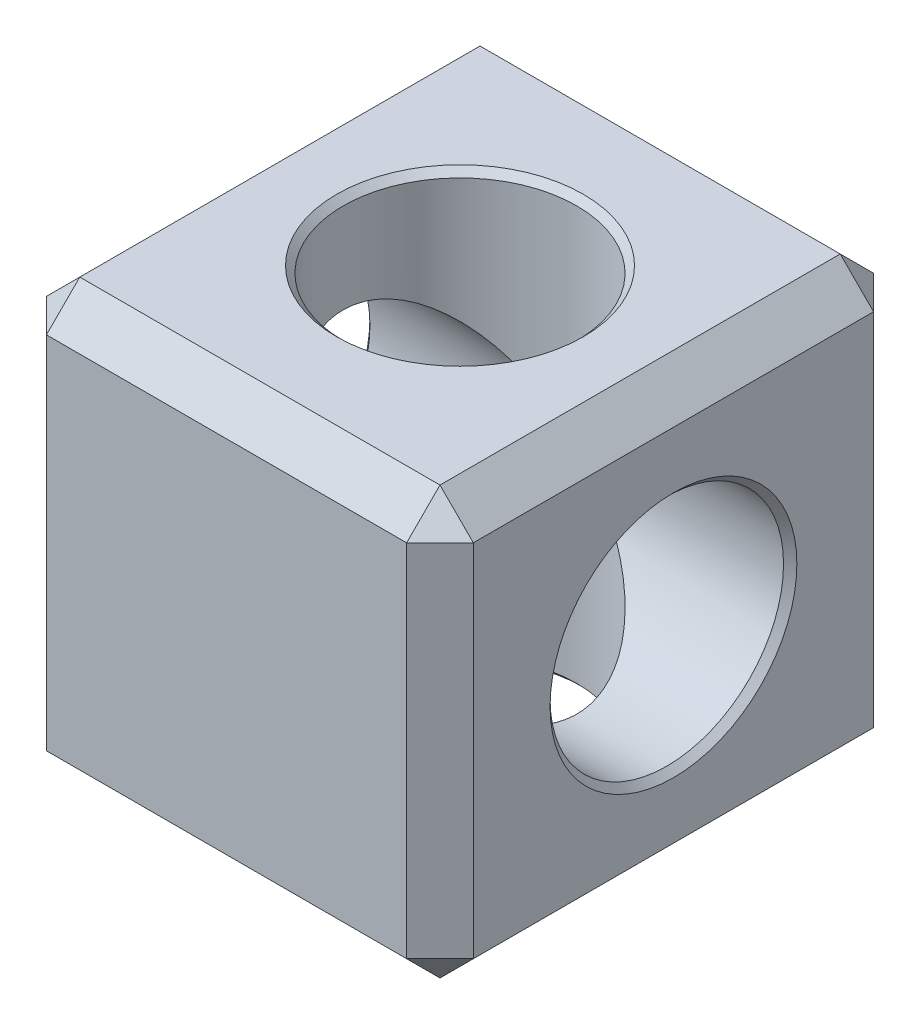
ISO-10303-21;
HEADER;
FILE_DESCRIPTION(('STEP AP214'),'2;1');
FILE_NAME('part.step','',(''),(''),'','','');
FILE_SCHEMA(('AUTOMOTIVE_DESIGN { 1 0 10303 214 1 1 1 1 }'));
ENDSEC;
DATA;
#1=APPLICATION_CONTEXT('core data for automotive mechanical design processes');
#2=APPLICATION_PROTOCOL_DEFINITION('international standard','automotive_design',2000,#1);
#3=PRODUCT_CONTEXT('',#1,'mechanical');
#4=PRODUCT('Part','Part','',(#3));
#5=PRODUCT_RELATED_PRODUCT_CATEGORY('part','',(#4));
#6=PRODUCT_DEFINITION_FORMATION('','',#4);
#7=PRODUCT_DEFINITION_CONTEXT('part definition',#1,'design');
#8=PRODUCT_DEFINITION('design','',#6,#7);
#9=PRODUCT_DEFINITION_SHAPE('','',#8);
#10=(LENGTH_UNIT() NAMED_UNIT(*) SI_UNIT(.MILLI.,.METRE.));
#11=(NAMED_UNIT(*) PLANE_ANGLE_UNIT() SI_UNIT($,.RADIAN.));
#12=(NAMED_UNIT(*) SI_UNIT($,.STERADIAN.) SOLID_ANGLE_UNIT());
#13=UNCERTAINTY_MEASURE_WITH_UNIT(LENGTH_MEASURE(1.E-05),#10,'distance_accuracy_value','');
#14=(GEOMETRIC_REPRESENTATION_CONTEXT(3) GLOBAL_UNCERTAINTY_ASSIGNED_CONTEXT((#13)) GLOBAL_UNIT_ASSIGNED_CONTEXT((#10,
#11,#12)) REPRESENTATION_CONTEXT('',''));
#15=CARTESIAN_POINT('',(0.,0.,0.));
#16=DIRECTION('',(0.,0.,1.));
#17=DIRECTION('',(1.,0.,0.));
#18=AXIS2_PLACEMENT_3D('',#15,#16,#17);
#19=CARTESIAN_POINT('',(0.,-32.,0.));
#20=DIRECTION('',(0.,1.,0.));
#21=DIRECTION('',(0.,0.,1.));
#22=AXIS2_PLACEMENT_3D('',#19,#20,#21);
#23=CYLINDRICAL_SURFACE('',#22,17.5);
#24=CARTESIAN_POINT('',(0.,31.,0.));
#25=DIRECTION('',(0.,-1.,0.));
#26=DIRECTION('',(0.,0.,-1.));
#27=AXIS2_PLACEMENT_3D('',#24,#25,#26);
#28=CIRCLE('',#27,17.5);
#29=CARTESIAN_POINT('',(0.,31.,-17.5));
#30=VERTEX_POINT('',#29);
#31=EDGE_CURVE('E282',#30,#30,#28,.F.);
#32=ORIENTED_EDGE('',*,*,#31,.T.);
#33=EDGE_LOOP('',(#32));
#34=FACE_BOUND('',#33,.T.);
#35=CARTESIAN_POINT('',(0.,0.,0.));
#36=DIRECTION('',(0.707106781186544,-0.707106781186551,0.));
#37=DIRECTION('',(-0.707106781186551,-0.707106781186544,0.));
#38=AXIS2_PLACEMENT_3D('',#35,#36,#37);
#39=ELLIPSE('',#38,24.748737341529,17.5);
#40=CARTESIAN_POINT('',(0.,0.,-17.5));
#41=VERTEX_POINT('',#40);
#42=CARTESIAN_POINT('',(0.,0.,17.5));
#43=VERTEX_POINT('',#42);
#44=EDGE_CURVE('E135',#41,#43,#39,.T.);
#45=ORIENTED_EDGE('',*,*,#44,.T.);
#46=CARTESIAN_POINT('',(0.,0.,0.));
#47=DIRECTION('',(-0.707106781186551,-0.707106781186544,0.));
#48=DIRECTION('',(0.707106781186544,-0.707106781186551,0.));
#49=AXIS2_PLACEMENT_3D('',#46,#47,#48);
#50=ELLIPSE('',#49,24.7487373415293,17.5);
#51=EDGE_CURVE('E133',#43,#41,#50,.T.);
#52=ORIENTED_EDGE('',*,*,#51,.T.);
#53=EDGE_LOOP('',(#45,#52));
#54=FACE_BOUND('',#53,.T.);
#55=ADVANCED_FACE('F38',(#34,#54),#23,.F.);
#56=CARTESIAN_POINT('',(32.,32.,35.));
#57=DIRECTION('',(-1.,0.,0.));
#58=DIRECTION('',(0.,0.,1.));
#59=AXIS2_PLACEMENT_3D('',#56,#57,#58);
#60=PLANE('',#59);
#61=CARTESIAN_POINT('',(32.,-1.1172740284298E-13,0.));
#62=DIRECTION('',(-1.,0.,0.));
#63=DIRECTION('',(0.,0.,1.));
#64=AXIS2_PLACEMENT_3D('',#61,#62,#63);
#65=CIRCLE('',#64,18.4999999999999);
#66=CARTESIAN_POINT('',(32.,-1.1172740284298E-13,18.4999999999999));
#67=VERTEX_POINT('',#66);
#68=EDGE_CURVE('E279',#67,#67,#65,.T.);
#69=ORIENTED_EDGE('',*,*,#68,.T.);
#70=EDGE_LOOP('',(#69));
#71=FACE_BOUND('',#70,.T.);
#72=DIRECTION('',(0.,0.,1.));
#73=VECTOR('',#72,1.);
#74=CARTESIAN_POINT('',(32.,27.,35.));
#75=LINE('',#74,#73);
#76=CARTESIAN_POINT('',(32.,27.,-30.));
#77=VERTEX_POINT('',#76);
#78=CARTESIAN_POINT('',(32.,27.,30.));
#79=VERTEX_POINT('',#78);
#80=EDGE_CURVE('E172',#77,#79,#75,.T.);
#81=ORIENTED_EDGE('',*,*,#80,.T.);
#82=DIRECTION('',(0.,-1.,0.));
#83=VECTOR('',#82,1.);
#84=CARTESIAN_POINT('',(32.,32.,30.));
#85=LINE('',#84,#83);
#86=CARTESIAN_POINT('',(32.,-27.,30.));
#87=VERTEX_POINT('',#86);
#88=EDGE_CURVE('E178',#79,#87,#85,.T.);
#89=ORIENTED_EDGE('',*,*,#88,.T.);
#90=DIRECTION('',(0.,0.,-1.));
#91=VECTOR('',#90,1.);
#92=CARTESIAN_POINT('',(32.,-27.,-35.));
#93=LINE('',#92,#91);
#94=CARTESIAN_POINT('',(32.,-27.,-30.));
#95=VERTEX_POINT('',#94);
#96=EDGE_CURVE('E176',#87,#95,#93,.T.);
#97=ORIENTED_EDGE('',*,*,#96,.T.);
#98=DIRECTION('',(0.,1.,0.));
#99=VECTOR('',#98,1.);
#100=CARTESIAN_POINT('',(32.,32.,-30.));
#101=LINE('',#100,#99);
#102=EDGE_CURVE('E174',#95,#77,#101,.T.);
#103=ORIENTED_EDGE('',*,*,#102,.T.);
#104=EDGE_LOOP('',(#81,#89,#97,#103));
#105=FACE_BOUND('',#104,.T.);
#106=ADVANCED_FACE('F303',(#71,#105),#60,.F.);
#107=CARTESIAN_POINT('',(-32.,32.,-35.));
#108=DIRECTION('',(0.,0.,1.));
#109=DIRECTION('',(1.,0.,0.));
#110=AXIS2_PLACEMENT_3D('',#107,#108,#109);
#111=PLANE('',#110);
#112=DIRECTION('',(-1.,0.,0.));
#113=VECTOR('',#112,1.);
#114=CARTESIAN_POINT('',(-32.,-27.,-35.));
#115=LINE('',#114,#113);
#116=CARTESIAN_POINT('',(27.,-27.,-35.));
#117=VERTEX_POINT('',#116);
#118=CARTESIAN_POINT('',(-27.,-27.,-35.));
#119=VERTEX_POINT('',#118);
#120=EDGE_CURVE('E194',#117,#119,#115,.T.);
#121=ORIENTED_EDGE('',*,*,#120,.T.);
#122=DIRECTION('',(0.,1.,0.));
#123=VECTOR('',#122,1.);
#124=CARTESIAN_POINT('',(-27.,32.,-35.));
#125=LINE('',#124,#123);
#126=CARTESIAN_POINT('',(-27.,27.,-35.));
#127=VERTEX_POINT('',#126);
#128=EDGE_CURVE('E196',#119,#127,#125,.T.);
#129=ORIENTED_EDGE('',*,*,#128,.T.);
#130=DIRECTION('',(1.,0.,0.));
#131=VECTOR('',#130,1.);
#132=CARTESIAN_POINT('',(-32.,27.,-35.));
#133=LINE('',#132,#131);
#134=CARTESIAN_POINT('',(27.,27.,-35.));
#135=VERTEX_POINT('',#134);
#136=EDGE_CURVE('E190',#127,#135,#133,.T.);
#137=ORIENTED_EDGE('',*,*,#136,.T.);
#138=DIRECTION('',(0.,-1.,0.));
#139=VECTOR('',#138,1.);
#140=CARTESIAN_POINT('',(27.,32.,-35.));
#141=LINE('',#140,#139);
#142=EDGE_CURVE('E192',#135,#117,#141,.T.);
#143=ORIENTED_EDGE('',*,*,#142,.T.);
#144=EDGE_LOOP('',(#121,#129,#137,#143));
#145=FACE_BOUND('',#144,.T.);
#146=ADVANCED_FACE('F309',(#145),#111,.F.);
#147=CARTESIAN_POINT('',(-32.,32.,35.));
#148=DIRECTION('',(1.,0.,0.));
#149=DIRECTION('',(0.,0.,-1.));
#150=AXIS2_PLACEMENT_3D('',#147,#148,#149);
#151=PLANE('',#150);
#152=CARTESIAN_POINT('',(-32.,1.1172740284298E-13,0.));
#153=DIRECTION('',(1.,0.,0.));
#154=DIRECTION('',(0.,0.,-1.));
#155=AXIS2_PLACEMENT_3D('',#152,#153,#154);
#156=CIRCLE('',#155,18.4999999999998);
#157=CARTESIAN_POINT('',(-32.,1.1172740284298E-13,-18.4999999999998));
#158=VERTEX_POINT('',#157);
#159=EDGE_CURVE('E47',#158,#158,#156,.T.);
#160=ORIENTED_EDGE('',*,*,#159,.T.);
#161=EDGE_LOOP('',(#160));
#162=FACE_BOUND('',#161,.T.);
#163=DIRECTION('',(0.,0.,1.));
#164=VECTOR('',#163,1.);
#165=CARTESIAN_POINT('',(-32.,-27.,35.));
#166=LINE('',#165,#164);
#167=CARTESIAN_POINT('',(-32.,-27.,-30.));
#168=VERTEX_POINT('',#167);
#169=CARTESIAN_POINT('',(-32.,-27.,30.));
#170=VERTEX_POINT('',#169);
#171=EDGE_CURVE('E185',#168,#170,#166,.T.);
#172=ORIENTED_EDGE('',*,*,#171,.T.);
#173=DIRECTION('',(0.,1.,0.));
#174=VECTOR('',#173,1.);
#175=CARTESIAN_POINT('',(-32.,32.,30.));
#176=LINE('',#175,#174);
#177=CARTESIAN_POINT('',(-32.,27.,30.));
#178=VERTEX_POINT('',#177);
#179=EDGE_CURVE('E187',#170,#178,#176,.T.);
#180=ORIENTED_EDGE('',*,*,#179,.T.);
#181=DIRECTION('',(0.,0.,-1.));
#182=VECTOR('',#181,1.);
#183=CARTESIAN_POINT('',(-32.,27.,35.));
#184=LINE('',#183,#182);
#185=CARTESIAN_POINT('',(-32.,27.,-30.));
#186=VERTEX_POINT('',#185);
#187=EDGE_CURVE('E181',#178,#186,#184,.T.);
#188=ORIENTED_EDGE('',*,*,#187,.T.);
#189=DIRECTION('',(0.,-1.,0.));
#190=VECTOR('',#189,1.);
#191=CARTESIAN_POINT('',(-32.,32.,-30.));
#192=LINE('',#191,#190);
#193=EDGE_CURVE('E183',#186,#168,#192,.T.);
#194=ORIENTED_EDGE('',*,*,#193,.T.);
#195=EDGE_LOOP('',(#172,#180,#188,#194));
#196=FACE_BOUND('',#195,.T.);
#197=ADVANCED_FACE('F290',(#162,#196),#151,.F.);
#198=CARTESIAN_POINT('',(-32.,32.,35.));
#199=DIRECTION('',(0.,0.,-1.));
#200=DIRECTION('',(-1.,0.,0.));
#201=AXIS2_PLACEMENT_3D('',#198,#199,#200);
#202=PLANE('',#201);
#203=DIRECTION('',(0.,-1.,0.));
#204=VECTOR('',#203,1.);
#205=CARTESIAN_POINT('',(-27.,32.,35.));
#206=LINE('',#205,#204);
#207=CARTESIAN_POINT('',(-27.,27.,35.));
#208=VERTEX_POINT('',#207);
#209=CARTESIAN_POINT('',(-27.,-27.,35.));
#210=VERTEX_POINT('',#209);
#211=EDGE_CURVE('E154',#208,#210,#206,.T.);
#212=ORIENTED_EDGE('',*,*,#211,.T.);
#213=DIRECTION('',(1.,0.,0.));
#214=VECTOR('',#213,1.);
#215=CARTESIAN_POINT('',(32.,-27.,35.));
#216=LINE('',#215,#214);
#217=CARTESIAN_POINT('',(27.,-27.,35.));
#218=VERTEX_POINT('',#217);
#219=EDGE_CURVE('E160',#210,#218,#216,.T.);
#220=ORIENTED_EDGE('',*,*,#219,.T.);
#221=DIRECTION('',(0.,1.,0.));
#222=VECTOR('',#221,1.);
#223=CARTESIAN_POINT('',(27.,32.,35.));
#224=LINE('',#223,#222);
#225=CARTESIAN_POINT('',(27.,27.,35.));
#226=VERTEX_POINT('',#225);
#227=EDGE_CURVE('E158',#218,#226,#224,.T.);
#228=ORIENTED_EDGE('',*,*,#227,.T.);
#229=DIRECTION('',(-1.,0.,0.));
#230=VECTOR('',#229,1.);
#231=CARTESIAN_POINT('',(-32.,27.,35.));
#232=LINE('',#231,#230);
#233=EDGE_CURVE('E152',#226,#208,#232,.T.);
#234=ORIENTED_EDGE('',*,*,#233,.T.);
#235=EDGE_LOOP('',(#212,#220,#228,#234));
#236=FACE_BOUND('',#235,.T.);
#237=ADVANCED_FACE('F356',(#236),#202,.F.);
#238=CARTESIAN_POINT('',(0.,32.,0.));
#239=DIRECTION('',(0.,-1.,0.));
#240=DIRECTION('',(0.,0.,-1.));
#241=AXIS2_PLACEMENT_3D('',#238,#239,#240);
#242=PLANE('',#241);
#243=CARTESIAN_POINT('',(0.,32.,0.));
#244=DIRECTION('',(0.,-1.,0.));
#245=DIRECTION('',(0.,0.,-1.));
#246=AXIS2_PLACEMENT_3D('',#243,#244,#245);
#247=CIRCLE('',#246,18.5);
#248=CARTESIAN_POINT('',(0.,32.,-18.5));
#249=VERTEX_POINT('',#248);
#250=EDGE_CURVE('E285',#249,#249,#247,.T.);
#251=ORIENTED_EDGE('',*,*,#250,.T.);
#252=EDGE_LOOP('',(#251));
#253=FACE_BOUND('',#252,.T.);
#254=DIRECTION('',(0.,0.,1.));
#255=VECTOR('',#254,1.);
#256=CARTESIAN_POINT('',(-27.,32.,0.));
#257=LINE('',#256,#255);
#258=CARTESIAN_POINT('',(-27.,32.,-30.));
#259=VERTEX_POINT('',#258);
#260=CARTESIAN_POINT('',(-27.,32.,30.));
#261=VERTEX_POINT('',#260);
#262=EDGE_CURVE('E54',#259,#261,#257,.T.);
#263=ORIENTED_EDGE('',*,*,#262,.T.);
#264=DIRECTION('',(1.,0.,0.));
#265=VECTOR('',#264,1.);
#266=CARTESIAN_POINT('',(0.,32.,30.));
#267=LINE('',#266,#265);
#268=CARTESIAN_POINT('',(27.,32.,30.));
#269=VERTEX_POINT('',#268);
#270=EDGE_CURVE('E203',#261,#269,#267,.T.);
#271=ORIENTED_EDGE('',*,*,#270,.T.);
#272=DIRECTION('',(0.,0.,-1.));
#273=VECTOR('',#272,1.);
#274=CARTESIAN_POINT('',(27.,32.,0.));
#275=LINE('',#274,#273);
#276=CARTESIAN_POINT('',(27.,32.,-30.));
#277=VERTEX_POINT('',#276);
#278=EDGE_CURVE('E199',#269,#277,#275,.T.);
#279=ORIENTED_EDGE('',*,*,#278,.T.);
#280=DIRECTION('',(-1.,0.,0.));
#281=VECTOR('',#280,1.);
#282=CARTESIAN_POINT('',(0.,32.,-30.));
#283=LINE('',#282,#281);
#284=EDGE_CURVE('E59',#277,#259,#283,.T.);
#285=ORIENTED_EDGE('',*,*,#284,.T.);
#286=EDGE_LOOP('',(#263,#271,#279,#285));
#287=FACE_BOUND('',#286,.T.);
#288=ADVANCED_FACE('F322',(#253,#287),#242,.F.);
#289=CARTESIAN_POINT('',(0.,-32.,0.));
#290=DIRECTION('',(0.,-1.,0.));
#291=DIRECTION('',(0.,0.,-1.));
#292=AXIS2_PLACEMENT_3D('',#289,#290,#291);
#293=PLANE('',#292);
#294=CARTESIAN_POINT('',(0.,-32.,0.));
#295=DIRECTION('',(0.,-1.,0.));
#296=DIRECTION('',(0.,0.,-1.));
#297=AXIS2_PLACEMENT_3D('',#294,#295,#296);
#298=CIRCLE('',#297,18.5);
#299=CARTESIAN_POINT('',(0.,-32.,-18.5));
#300=VERTEX_POINT('',#299);
#301=EDGE_CURVE('E205',#300,#300,#298,.F.);
#302=ORIENTED_EDGE('',*,*,#301,.T.);
#303=EDGE_LOOP('',(#302));
#304=FACE_BOUND('',#303,.T.);
#305=DIRECTION('',(0.,0.,1.));
#306=VECTOR('',#305,1.);
#307=CARTESIAN_POINT('',(27.,-32.,35.));
#308=LINE('',#307,#306);
#309=CARTESIAN_POINT('',(27.,-32.,-30.));
#310=VERTEX_POINT('',#309);
#311=CARTESIAN_POINT('',(27.,-32.,30.));
#312=VERTEX_POINT('',#311);
#313=EDGE_CURVE('E163',#310,#312,#308,.T.);
#314=ORIENTED_EDGE('',*,*,#313,.T.);
#315=DIRECTION('',(-1.,0.,0.));
#316=VECTOR('',#315,1.);
#317=CARTESIAN_POINT('',(-32.,-32.,30.));
#318=LINE('',#317,#316);
#319=CARTESIAN_POINT('',(-27.,-32.,30.));
#320=VERTEX_POINT('',#319);
#321=EDGE_CURVE('E169',#312,#320,#318,.T.);
#322=ORIENTED_EDGE('',*,*,#321,.T.);
#323=DIRECTION('',(0.,0.,-1.));
#324=VECTOR('',#323,1.);
#325=CARTESIAN_POINT('',(-27.,-32.,-35.));
#326=LINE('',#325,#324);
#327=CARTESIAN_POINT('',(-27.,-32.,-30.));
#328=VERTEX_POINT('',#327);
#329=EDGE_CURVE('E167',#320,#328,#326,.T.);
#330=ORIENTED_EDGE('',*,*,#329,.T.);
#331=DIRECTION('',(1.,0.,0.));
#332=VECTOR('',#331,1.);
#333=CARTESIAN_POINT('',(32.,-32.,-30.));
#334=LINE('',#333,#332);
#335=EDGE_CURVE('E165',#328,#310,#334,.T.);
#336=ORIENTED_EDGE('',*,*,#335,.T.);
#337=EDGE_LOOP('',(#314,#322,#330,#336));
#338=FACE_BOUND('',#337,.T.);
#339=ADVANCED_FACE('F315',(#304,#338),#293,.T.);
#340=CARTESIAN_POINT('',(0.,-31.,0.));
#341=DIRECTION('',(0.,-1.,0.));
#342=DIRECTION('',(0.,0.,-1.));
#343=AXIS2_PLACEMENT_3D('',#340,#341,#342);
#344=CIRCLE('',#343,17.5);
#345=CARTESIAN_POINT('',(0.,-31.,-17.5));
#346=VERTEX_POINT('',#345);
#347=EDGE_CURVE('E273',#346,#346,#344,.T.);
#348=ORIENTED_EDGE('',*,*,#347,.T.);
#349=EDGE_LOOP('',(#348));
#350=FACE_BOUND('',#349,.T.);
#351=CARTESIAN_POINT('',(0.,0.,0.));
#352=DIRECTION('',(-0.707106781186551,-0.707106781186544,0.));
#353=DIRECTION('',(0.707106781186544,-0.707106781186551,0.));
#354=AXIS2_PLACEMENT_3D('',#351,#352,#353);
#355=ELLIPSE('',#354,24.7487373415293,17.5);
#356=EDGE_CURVE('E140',#43,#41,#355,.F.);
#357=ORIENTED_EDGE('',*,*,#356,.T.);
#358=CARTESIAN_POINT('',(0.,0.,0.));
#359=DIRECTION('',(0.707106781186544,-0.707106781186551,0.));
#360=DIRECTION('',(-0.707106781186551,-0.707106781186544,0.));
#361=AXIS2_PLACEMENT_3D('',#358,#359,#360);
#362=ELLIPSE('',#361,24.748737341529,17.5);
#363=EDGE_CURVE('E145',#41,#43,#362,.F.);
#364=ORIENTED_EDGE('',*,*,#363,.T.);
#365=EDGE_LOOP('',(#357,#364));
#366=FACE_BOUND('',#365,.T.);
#367=ADVANCED_FACE('F151',(#350,#366),#23,.F.);
#368=CARTESIAN_POINT('',(-32.0000000000001,1.11727402842981E-13,0.));
#369=DIRECTION('',(1.,0.,0.));
#370=DIRECTION('',(0.,1.,0.));
#371=AXIS2_PLACEMENT_3D('',#368,#369,#370);
#372=CYLINDRICAL_SURFACE('',#371,17.5);
#373=CARTESIAN_POINT('',(31.0000000000001,-1.08235921504137E-13,0.));
#374=DIRECTION('',(-1.,0.,0.));
#375=DIRECTION('',(0.,-1.,0.));
#376=AXIS2_PLACEMENT_3D('',#373,#374,#375);
#377=CIRCLE('',#376,17.5);
#378=CARTESIAN_POINT('',(31.,-17.5000000000001,0.));
#379=VERTEX_POINT('',#378);
#380=EDGE_CURVE('E276',#379,#379,#377,.F.);
#381=ORIENTED_EDGE('',*,*,#380,.T.);
#382=EDGE_LOOP('',(#381));
#383=FACE_BOUND('',#382,.T.);
#384=ORIENTED_EDGE('',*,*,#44,.F.);
#385=ORIENTED_EDGE('',*,*,#356,.F.);
#386=EDGE_LOOP('',(#384,#385));
#387=FACE_BOUND('',#386,.T.);
#388=ADVANCED_FACE('F143',(#383,#387),#372,.F.);
#389=CARTESIAN_POINT('',(-31.0000000000002,1.08235921504138E-13,0.));
#390=DIRECTION('',(1.,0.,0.));
#391=DIRECTION('',(0.,1.,0.));
#392=AXIS2_PLACEMENT_3D('',#389,#390,#391);
#393=CIRCLE('',#392,17.5);
#394=CARTESIAN_POINT('',(-31.0000000000001,17.5000000000001,0.));
#395=VERTEX_POINT('',#394);
#396=EDGE_CURVE('E11',#395,#395,#393,.F.);
#397=ORIENTED_EDGE('',*,*,#396,.T.);
#398=EDGE_LOOP('',(#397));
#399=FACE_BOUND('',#398,.T.);
#400=ORIENTED_EDGE('',*,*,#51,.F.);
#401=ORIENTED_EDGE('',*,*,#363,.F.);
#402=EDGE_LOOP('',(#400,#401));
#403=FACE_BOUND('',#402,.T.);
#404=ADVANCED_FACE('F147',(#399,#403),#372,.F.);
#405=CARTESIAN_POINT('',(0.,32.,-30.));
#406=DIRECTION('',(0.,-0.707106781186545,0.707106781186549));
#407=DIRECTION('',(-1.,0.,0.));
#408=AXIS2_PLACEMENT_3D('',#405,#406,#407);
#409=PLANE('',#408);
#410=DIRECTION('',(0.,0.707106781186549,0.707106781186546));
#411=VECTOR('',#410,1.);
#412=CARTESIAN_POINT('',(-27.,27.,-35.));
#413=LINE('',#412,#411);
#414=EDGE_CURVE('E149',#259,#127,#413,.F.);
#415=ORIENTED_EDGE('',*,*,#414,.F.);
#416=ORIENTED_EDGE('',*,*,#284,.F.);
#417=DIRECTION('',(0.,-0.707106781186549,-0.707106781186546));
#418=VECTOR('',#417,1.);
#419=CARTESIAN_POINT('',(27.,29.5,-32.5));
#420=LINE('',#419,#418);
#421=EDGE_CURVE('E266',#135,#277,#420,.F.);
#422=ORIENTED_EDGE('',*,*,#421,.F.);
#423=ORIENTED_EDGE('',*,*,#136,.F.);
#424=EDGE_LOOP('',(#415,#416,#422,#423));
#425=FACE_BOUND('',#424,.T.);
#426=ADVANCED_FACE('F475',(#425),#409,.F.);
#427=CARTESIAN_POINT('',(-27.,27.,-35.));
#428=DIRECTION('',(-0.577350269189626,0.577350269189623,-0.577350269189629));
#429=DIRECTION('',(-0.707106781186549,0.,0.707106781186545));
#430=AXIS2_PLACEMENT_3D('',#427,#428,#429);
#431=PLANE('',#430);
#432=DIRECTION('',(-0.707106781186546,-0.707106781186549,0.));
#433=VECTOR('',#432,1.);
#434=CARTESIAN_POINT('',(-29.5,29.5,-30.));
#435=LINE('',#434,#433);
#436=EDGE_CURVE('E261',#259,#186,#435,.T.);
#437=ORIENTED_EDGE('',*,*,#436,.F.);
#438=ORIENTED_EDGE('',*,*,#414,.T.);
#439=DIRECTION('',(0.707106781186549,0.,-0.707106781186546));
#440=VECTOR('',#439,1.);
#441=CARTESIAN_POINT('',(-27.,27.,-35.));
#442=LINE('',#441,#440);
#443=EDGE_CURVE('E264',#186,#127,#442,.T.);
#444=ORIENTED_EDGE('',*,*,#443,.F.);
#445=EDGE_LOOP('',(#437,#438,#444));
#446=FACE_BOUND('',#445,.T.);
#447=ADVANCED_FACE('F468',(#446),#431,.T.);
#448=CARTESIAN_POINT('',(32.,27.,-30.));
#449=DIRECTION('',(0.577350269189629,0.577350269189623,-0.577350269189626));
#450=DIRECTION('',(-0.707106781186545,0.,-0.707106781186549));
#451=AXIS2_PLACEMENT_3D('',#448,#449,#450);
#452=PLANE('',#451);
#453=DIRECTION('',(0.707106781186546,0.,0.707106781186549));
#454=VECTOR('',#453,1.);
#455=CARTESIAN_POINT('',(32.,27.,-30.));
#456=LINE('',#455,#454);
#457=EDGE_CURVE('E255',#135,#77,#456,.T.);
#458=ORIENTED_EDGE('',*,*,#457,.F.);
#459=ORIENTED_EDGE('',*,*,#421,.T.);
#460=DIRECTION('',(-0.707106781186546,0.707106781186549,0.));
#461=VECTOR('',#460,1.);
#462=CARTESIAN_POINT('',(32.,27.,-30.));
#463=LINE('',#462,#461);
#464=EDGE_CURVE('E258',#77,#277,#463,.T.);
#465=ORIENTED_EDGE('',*,*,#464,.F.);
#466=EDGE_LOOP('',(#458,#459,#465));
#467=FACE_BOUND('',#466,.T.);
#468=ADVANCED_FACE('F462',(#467),#452,.T.);
#469=CARTESIAN_POINT('',(-32.,32.,-30.));
#470=DIRECTION('',(0.707106781186545,0.,0.707106781186549));
#471=DIRECTION('',(0.,-1.,0.));
#472=AXIS2_PLACEMENT_3D('',#469,#470,#471);
#473=PLANE('',#472);
#474=ORIENTED_EDGE('',*,*,#443,.T.);
#475=ORIENTED_EDGE('',*,*,#128,.F.);
#476=DIRECTION('',(-0.707106781186549,0.,0.707106781186546));
#477=VECTOR('',#476,1.);
#478=CARTESIAN_POINT('',(-29.5,-27.,-32.5));
#479=LINE('',#478,#477);
#480=EDGE_CURVE('E249',#168,#119,#479,.F.);
#481=ORIENTED_EDGE('',*,*,#480,.F.);
#482=ORIENTED_EDGE('',*,*,#193,.F.);
#483=EDGE_LOOP('',(#474,#475,#481,#482));
#484=FACE_BOUND('',#483,.T.);
#485=ADVANCED_FACE('F382',(#484),#473,.F.);
#486=CARTESIAN_POINT('',(-27.,32.,0.));
#487=DIRECTION('',(0.707106781186549,-0.707106781186545,0.));
#488=DIRECTION('',(0.,0.,1.));
#489=AXIS2_PLACEMENT_3D('',#486,#487,#488);
#490=PLANE('',#489);
#491=ORIENTED_EDGE('',*,*,#436,.T.);
#492=ORIENTED_EDGE('',*,*,#187,.F.);
#493=DIRECTION('',(0.707106781186546,0.707106781186549,0.));
#494=VECTOR('',#493,1.);
#495=CARTESIAN_POINT('',(-32.,27.,30.));
#496=LINE('',#495,#494);
#497=EDGE_CURVE('E246',#261,#178,#496,.F.);
#498=ORIENTED_EDGE('',*,*,#497,.F.);
#499=ORIENTED_EDGE('',*,*,#262,.F.);
#500=EDGE_LOOP('',(#491,#492,#498,#499));
#501=FACE_BOUND('',#500,.T.);
#502=ADVANCED_FACE('F449',(#501),#490,.F.);
#503=CARTESIAN_POINT('',(0.,32.,30.));
#504=DIRECTION('',(0.,-0.707106781186545,-0.707106781186549));
#505=DIRECTION('',(1.,0.,0.));
#506=AXIS2_PLACEMENT_3D('',#503,#504,#505);
#507=PLANE('',#506);
#508=DIRECTION('',(0.,0.707106781186549,-0.707106781186546));
#509=VECTOR('',#508,1.);
#510=CARTESIAN_POINT('',(27.,27.,35.));
#511=LINE('',#510,#509);
#512=EDGE_CURVE('E240',#269,#226,#511,.F.);
#513=ORIENTED_EDGE('',*,*,#512,.F.);
#514=ORIENTED_EDGE('',*,*,#270,.F.);
#515=DIRECTION('',(0.,-0.707106781186549,0.707106781186546));
#516=VECTOR('',#515,1.);
#517=CARTESIAN_POINT('',(-27.,29.5,32.5));
#518=LINE('',#517,#516);
#519=EDGE_CURVE('E243',#208,#261,#518,.F.);
#520=ORIENTED_EDGE('',*,*,#519,.F.);
#521=ORIENTED_EDGE('',*,*,#233,.F.);
#522=EDGE_LOOP('',(#513,#514,#520,#521));
#523=FACE_BOUND('',#522,.T.);
#524=ADVANCED_FACE('F442',(#523),#507,.F.);
#525=CARTESIAN_POINT('',(27.,32.,0.));
#526=DIRECTION('',(-0.707106781186549,-0.707106781186545,0.));
#527=DIRECTION('',(0.,0.,-1.));
#528=AXIS2_PLACEMENT_3D('',#525,#526,#527);
#529=PLANE('',#528);
#530=ORIENTED_EDGE('',*,*,#464,.T.);
#531=ORIENTED_EDGE('',*,*,#278,.F.);
#532=DIRECTION('',(0.707106781186546,-0.707106781186549,0.));
#533=VECTOR('',#532,1.);
#534=CARTESIAN_POINT('',(29.5,29.5,30.));
#535=LINE('',#534,#533);
#536=EDGE_CURVE('E238',#79,#269,#535,.F.);
#537=ORIENTED_EDGE('',*,*,#536,.F.);
#538=ORIENTED_EDGE('',*,*,#80,.F.);
#539=EDGE_LOOP('',(#530,#531,#537,#538));
#540=FACE_BOUND('',#539,.T.);
#541=ADVANCED_FACE('F436',(#540),#529,.F.);
#542=CARTESIAN_POINT('',(27.,32.,-35.));
#543=DIRECTION('',(-0.707106781186549,0.,0.707106781186545));
#544=DIRECTION('',(0.,-1.,0.));
#545=AXIS2_PLACEMENT_3D('',#542,#543,#544);
#546=PLANE('',#545);
#547=ORIENTED_EDGE('',*,*,#457,.T.);
#548=ORIENTED_EDGE('',*,*,#102,.F.);
#549=DIRECTION('',(-0.707106781186546,0.,-0.707106781186549));
#550=VECTOR('',#549,1.);
#551=CARTESIAN_POINT('',(29.5,-27.,-32.5));
#552=LINE('',#551,#550);
#553=EDGE_CURVE('E235',#117,#95,#552,.F.);
#554=ORIENTED_EDGE('',*,*,#553,.F.);
#555=ORIENTED_EDGE('',*,*,#142,.F.);
#556=EDGE_LOOP('',(#547,#548,#554,#555));
#557=FACE_BOUND('',#556,.T.);
#558=ADVANCED_FACE('F391',(#557),#546,.F.);
#559=CARTESIAN_POINT('',(-32.,-27.,-35.));
#560=DIRECTION('',(0.,-0.707106781186549,-0.707106781186545));
#561=DIRECTION('',(1.,0.,0.));
#562=AXIS2_PLACEMENT_3D('',#559,#560,#561);
#563=PLANE('',#562);
#564=DIRECTION('',(0.,-0.707106781186546,0.707106781186549));
#565=VECTOR('',#564,1.);
#566=CARTESIAN_POINT('',(-27.,-32.,-30.));
#567=LINE('',#566,#565);
#568=EDGE_CURVE('E252',#119,#328,#567,.T.);
#569=ORIENTED_EDGE('',*,*,#568,.F.);
#570=ORIENTED_EDGE('',*,*,#120,.F.);
#571=DIRECTION('',(0.,0.707106781186546,-0.707106781186549));
#572=VECTOR('',#571,1.);
#573=CARTESIAN_POINT('',(27.,-32.,-30.));
#574=LINE('',#573,#572);
#575=EDGE_CURVE('E232',#310,#117,#574,.T.);
#576=ORIENTED_EDGE('',*,*,#575,.F.);
#577=ORIENTED_EDGE('',*,*,#335,.F.);
#578=EDGE_LOOP('',(#569,#570,#576,#577));
#579=FACE_BOUND('',#578,.T.);
#580=ADVANCED_FACE('F373',(#579),#563,.T.);
#581=CARTESIAN_POINT('',(-27.,-32.,-30.));
#582=DIRECTION('',(-0.577350269189623,-0.577350269189629,-0.577350269189626));
#583=DIRECTION('',(0.,0.707106781186545,-0.707106781186549));
#584=AXIS2_PLACEMENT_3D('',#581,#582,#583);
#585=PLANE('',#584);
#586=ORIENTED_EDGE('',*,*,#480,.T.);
#587=ORIENTED_EDGE('',*,*,#568,.T.);
#588=DIRECTION('',(-0.707106781186549,0.707106781186546,0.));
#589=VECTOR('',#588,1.);
#590=CARTESIAN_POINT('',(-27.,-32.,-30.));
#591=LINE('',#590,#589);
#592=EDGE_CURVE('E229',#168,#328,#591,.F.);
#593=ORIENTED_EDGE('',*,*,#592,.F.);
#594=EDGE_LOOP('',(#586,#587,#593));
#595=FACE_BOUND('',#594,.T.);
#596=ADVANCED_FACE('F377',(#595),#585,.T.);
#597=CARTESIAN_POINT('',(-32.,27.,30.));
#598=DIRECTION('',(-0.577350269189629,0.577350269189623,0.577350269189626));
#599=DIRECTION('',(0.707106781186545,0.,0.707106781186549));
#600=AXIS2_PLACEMENT_3D('',#597,#598,#599);
#601=PLANE('',#600);
#602=ORIENTED_EDGE('',*,*,#519,.T.);
#603=ORIENTED_EDGE('',*,*,#497,.T.);
#604=DIRECTION('',(-0.707106781186546,0.,-0.707106781186549));
#605=VECTOR('',#604,1.);
#606=CARTESIAN_POINT('',(-32.,27.,30.));
#607=LINE('',#606,#605);
#608=EDGE_CURVE('E227',#208,#178,#607,.T.);
#609=ORIENTED_EDGE('',*,*,#608,.F.);
#610=EDGE_LOOP('',(#602,#603,#609));
#611=FACE_BOUND('',#610,.T.);
#612=ADVANCED_FACE('F402',(#611),#601,.T.);
#613=CARTESIAN_POINT('',(27.,27.,35.));
#614=DIRECTION('',(0.577350269189629,0.577350269189623,0.577350269189626));
#615=DIRECTION('',(0.707106781186545,0.,-0.707106781186549));
#616=AXIS2_PLACEMENT_3D('',#613,#614,#615);
#617=PLANE('',#616);
#618=ORIENTED_EDGE('',*,*,#536,.T.);
#619=ORIENTED_EDGE('',*,*,#512,.T.);
#620=DIRECTION('',(-0.707106781186546,0.,0.707106781186549));
#621=VECTOR('',#620,1.);
#622=CARTESIAN_POINT('',(27.,27.,35.));
#623=LINE('',#622,#621);
#624=EDGE_CURVE('E224',#79,#226,#623,.T.);
#625=ORIENTED_EDGE('',*,*,#624,.F.);
#626=EDGE_LOOP('',(#618,#619,#625));
#627=FACE_BOUND('',#626,.T.);
#628=ADVANCED_FACE('F395',(#627),#617,.T.);
#629=CARTESIAN_POINT('',(27.,-32.,-30.));
#630=DIRECTION('',(0.577350269189629,-0.577350269189626,-0.577350269189623));
#631=DIRECTION('',(0.707106781186545,0.707106781186549,0.));
#632=AXIS2_PLACEMENT_3D('',#629,#630,#631);
#633=PLANE('',#632);
#634=ORIENTED_EDGE('',*,*,#575,.T.);
#635=ORIENTED_EDGE('',*,*,#553,.T.);
#636=DIRECTION('',(-0.707106781186546,-0.707106781186549,0.));
#637=VECTOR('',#636,1.);
#638=CARTESIAN_POINT('',(27.,-32.,-30.));
#639=LINE('',#638,#637);
#640=EDGE_CURVE('E221',#310,#95,#639,.F.);
#641=ORIENTED_EDGE('',*,*,#640,.F.);
#642=EDGE_LOOP('',(#634,#635,#641));
#643=FACE_BOUND('',#642,.T.);
#644=ADVANCED_FACE('F393',(#643),#633,.T.);
#645=CARTESIAN_POINT('',(-32.,-27.,35.));
#646=DIRECTION('',(-0.707106781186545,-0.707106781186549,0.));
#647=DIRECTION('',(0.,0.,-1.));
#648=AXIS2_PLACEMENT_3D('',#645,#646,#647);
#649=PLANE('',#648);
#650=ORIENTED_EDGE('',*,*,#592,.T.);
#651=ORIENTED_EDGE('',*,*,#329,.F.);
#652=DIRECTION('',(0.707106781186549,-0.707106781186546,0.));
#653=VECTOR('',#652,1.);
#654=CARTESIAN_POINT('',(-27.,-32.,30.));
#655=LINE('',#654,#653);
#656=EDGE_CURVE('E218',#170,#320,#655,.T.);
#657=ORIENTED_EDGE('',*,*,#656,.F.);
#658=ORIENTED_EDGE('',*,*,#171,.F.);
#659=EDGE_LOOP('',(#650,#651,#657,#658));
#660=FACE_BOUND('',#659,.T.);
#661=ADVANCED_FACE('F369',(#660),#649,.T.);
#662=CARTESIAN_POINT('',(-27.,32.,35.));
#663=DIRECTION('',(0.707106781186549,0.,-0.707106781186545));
#664=DIRECTION('',(0.,-1.,0.));
#665=AXIS2_PLACEMENT_3D('',#662,#663,#664);
#666=PLANE('',#665);
#667=ORIENTED_EDGE('',*,*,#608,.T.);
#668=ORIENTED_EDGE('',*,*,#179,.F.);
#669=DIRECTION('',(0.707106781186546,0.,0.707106781186549));
#670=VECTOR('',#669,1.);
#671=CARTESIAN_POINT('',(-29.5,-27.,32.5));
#672=LINE('',#671,#670);
#673=EDGE_CURVE('E215',#210,#170,#672,.F.);
#674=ORIENTED_EDGE('',*,*,#673,.F.);
#675=ORIENTED_EDGE('',*,*,#211,.F.);
#676=EDGE_LOOP('',(#667,#668,#674,#675));
#677=FACE_BOUND('',#676,.T.);
#678=ADVANCED_FACE('F362',(#677),#666,.F.);
#679=CARTESIAN_POINT('',(32.,32.,30.));
#680=DIRECTION('',(-0.707106781186549,0.,-0.707106781186545));
#681=DIRECTION('',(0.,-1.,0.));
#682=AXIS2_PLACEMENT_3D('',#679,#680,#681);
#683=PLANE('',#682);
#684=ORIENTED_EDGE('',*,*,#624,.T.);
#685=ORIENTED_EDGE('',*,*,#227,.F.);
#686=DIRECTION('',(0.707106781186546,0.,-0.707106781186549));
#687=VECTOR('',#686,1.);
#688=CARTESIAN_POINT('',(27.,-27.,35.));
#689=LINE('',#688,#687);
#690=EDGE_CURVE('E212',#87,#218,#689,.F.);
#691=ORIENTED_EDGE('',*,*,#690,.F.);
#692=ORIENTED_EDGE('',*,*,#88,.F.);
#693=EDGE_LOOP('',(#684,#685,#691,#692));
#694=FACE_BOUND('',#693,.T.);
#695=ADVANCED_FACE('F352',(#694),#683,.F.);
#696=CARTESIAN_POINT('',(32.,-27.,35.));
#697=DIRECTION('',(0.707106781186549,-0.707106781186545,0.));
#698=DIRECTION('',(0.,0.,1.));
#699=AXIS2_PLACEMENT_3D('',#696,#697,#698);
#700=PLANE('',#699);
#701=ORIENTED_EDGE('',*,*,#640,.T.);
#702=ORIENTED_EDGE('',*,*,#96,.F.);
#703=DIRECTION('',(0.707106781186546,0.707106781186549,0.));
#704=VECTOR('',#703,1.);
#705=CARTESIAN_POINT('',(29.5,-29.5,30.));
#706=LINE('',#705,#704);
#707=EDGE_CURVE('E210',#312,#87,#706,.T.);
#708=ORIENTED_EDGE('',*,*,#707,.F.);
#709=ORIENTED_EDGE('',*,*,#313,.F.);
#710=EDGE_LOOP('',(#701,#702,#708,#709));
#711=FACE_BOUND('',#710,.T.);
#712=ADVANCED_FACE('F341',(#711),#700,.T.);
#713=CARTESIAN_POINT('',(-27.,-32.,30.));
#714=DIRECTION('',(-0.577350269189626,-0.577350269189629,0.577350269189623));
#715=DIRECTION('',(0.707106781186549,-0.707106781186545,0.));
#716=AXIS2_PLACEMENT_3D('',#713,#714,#715);
#717=PLANE('',#716);
#718=ORIENTED_EDGE('',*,*,#673,.T.);
#719=ORIENTED_EDGE('',*,*,#656,.T.);
#720=DIRECTION('',(0.,0.707106781186546,0.707106781186549));
#721=VECTOR('',#720,1.);
#722=CARTESIAN_POINT('',(-27.,-32.,30.));
#723=LINE('',#722,#721);
#724=EDGE_CURVE('E208',#210,#320,#723,.F.);
#725=ORIENTED_EDGE('',*,*,#724,.F.);
#726=EDGE_LOOP('',(#718,#719,#725));
#727=FACE_BOUND('',#726,.T.);
#728=ADVANCED_FACE('F365',(#727),#717,.T.);
#729=CARTESIAN_POINT('',(27.,-27.,35.));
#730=DIRECTION('',(0.577350269189629,-0.577350269189626,0.577350269189623));
#731=DIRECTION('',(0.707106781186545,0.707106781186549,0.));
#732=AXIS2_PLACEMENT_3D('',#729,#730,#731);
#733=PLANE('',#732);
#734=ORIENTED_EDGE('',*,*,#707,.T.);
#735=ORIENTED_EDGE('',*,*,#690,.T.);
#736=DIRECTION('',(0.,-0.707106781186546,-0.707106781186549));
#737=VECTOR('',#736,1.);
#738=CARTESIAN_POINT('',(27.,-27.,35.));
#739=LINE('',#738,#737);
#740=EDGE_CURVE('E206',#312,#218,#739,.F.);
#741=ORIENTED_EDGE('',*,*,#740,.F.);
#742=EDGE_LOOP('',(#734,#735,#741));
#743=FACE_BOUND('',#742,.T.);
#744=ADVANCED_FACE('F348',(#743),#733,.T.);
#745=CARTESIAN_POINT('',(-32.,-27.,35.));
#746=DIRECTION('',(0.,-0.707106781186549,0.707106781186545));
#747=DIRECTION('',(-1.,0.,0.));
#748=AXIS2_PLACEMENT_3D('',#745,#746,#747);
#749=PLANE('',#748);
#750=ORIENTED_EDGE('',*,*,#724,.T.);
#751=ORIENTED_EDGE('',*,*,#321,.F.);
#752=ORIENTED_EDGE('',*,*,#740,.T.);
#753=ORIENTED_EDGE('',*,*,#219,.F.);
#754=EDGE_LOOP('',(#750,#751,#752,#753));
#755=FACE_BOUND('',#754,.T.);
#756=ADVANCED_FACE('F330',(#755),#749,.T.);
#757=CARTESIAN_POINT('',(0.,-32.,0.));
#758=DIRECTION('',(0.,-1.,0.));
#759=DIRECTION('',(0.,0.,-1.));
#760=AXIS2_PLACEMENT_3D('',#757,#758,#759);
#761=CONICAL_SURFACE('',#760,18.5,0.785398163397436);
#762=ORIENTED_EDGE('',*,*,#347,.F.);
#763=EDGE_LOOP('',(#762));
#764=FACE_BOUND('',#763,.T.);
#765=ORIENTED_EDGE('',*,*,#301,.F.);
#766=EDGE_LOOP('',(#765));
#767=FACE_BOUND('',#766,.T.);
#768=ADVANCED_FACE('F327',(#764,#767),#761,.F.);
#769=CARTESIAN_POINT('',(31.0000000000001,-1.08235921504137E-13,0.));
#770=DIRECTION('',(1.,0.,0.));
#771=DIRECTION('',(0.,1.,0.));
#772=AXIS2_PLACEMENT_3D('',#769,#770,#771);
#773=CONICAL_SURFACE('',#772,17.5,0.785398163397457);
#774=ORIENTED_EDGE('',*,*,#68,.F.);
#775=EDGE_LOOP('',(#774));
#776=FACE_BOUND('',#775,.T.);
#777=ORIENTED_EDGE('',*,*,#380,.F.);
#778=EDGE_LOOP('',(#777));
#779=FACE_BOUND('',#778,.T.);
#780=ADVANCED_FACE('F299',(#776,#779),#773,.F.);
#781=CARTESIAN_POINT('',(0.,31.,0.));
#782=DIRECTION('',(0.,1.,0.));
#783=DIRECTION('',(0.,0.,1.));
#784=AXIS2_PLACEMENT_3D('',#781,#782,#783);
#785=CONICAL_SURFACE('',#784,17.5,0.785398163397454);
#786=ORIENTED_EDGE('',*,*,#250,.F.);
#787=EDGE_LOOP('',(#786));
#788=FACE_BOUND('',#787,.T.);
#789=ORIENTED_EDGE('',*,*,#31,.F.);
#790=EDGE_LOOP('',(#789));
#791=FACE_BOUND('',#790,.T.);
#792=ADVANCED_FACE('F294',(#788,#791),#785,.F.);
#793=CARTESIAN_POINT('',(-32.,1.1172740284298E-13,0.));
#794=DIRECTION('',(-1.,0.,0.));
#795=DIRECTION('',(0.,-1.,0.));
#796=AXIS2_PLACEMENT_3D('',#793,#794,#795);
#797=CONICAL_SURFACE('',#796,18.4999999999998,0.785398163397445);
#798=ORIENTED_EDGE('',*,*,#396,.F.);
#799=EDGE_LOOP('',(#798));
#800=FACE_BOUND('',#799,.T.);
#801=ORIENTED_EDGE('',*,*,#159,.F.);
#802=EDGE_LOOP('',(#801));
#803=FACE_BOUND('',#802,.T.);
#804=ADVANCED_FACE('F41',(#800,#803),#797,.F.);
#805=CLOSED_SHELL('',(#55,#106,#146,#197,#237,#288,#339,#367,#388,#404,#426,#447,#468,#485,#502,
#524,#541,#558,#580,#596,#612,#628,#644,#661,#678,#695,#712,#728,#744,#756,#768,#780,#792,#804));
#806=MANIFOLD_SOLID_BREP('B2',#805);
#807=ADVANCED_BREP_SHAPE_REPRESENTATION('',(#18,#806),#14);
#808=SHAPE_DEFINITION_REPRESENTATION(#9,#807);
ENDSEC;
END-ISO-10303-21;
